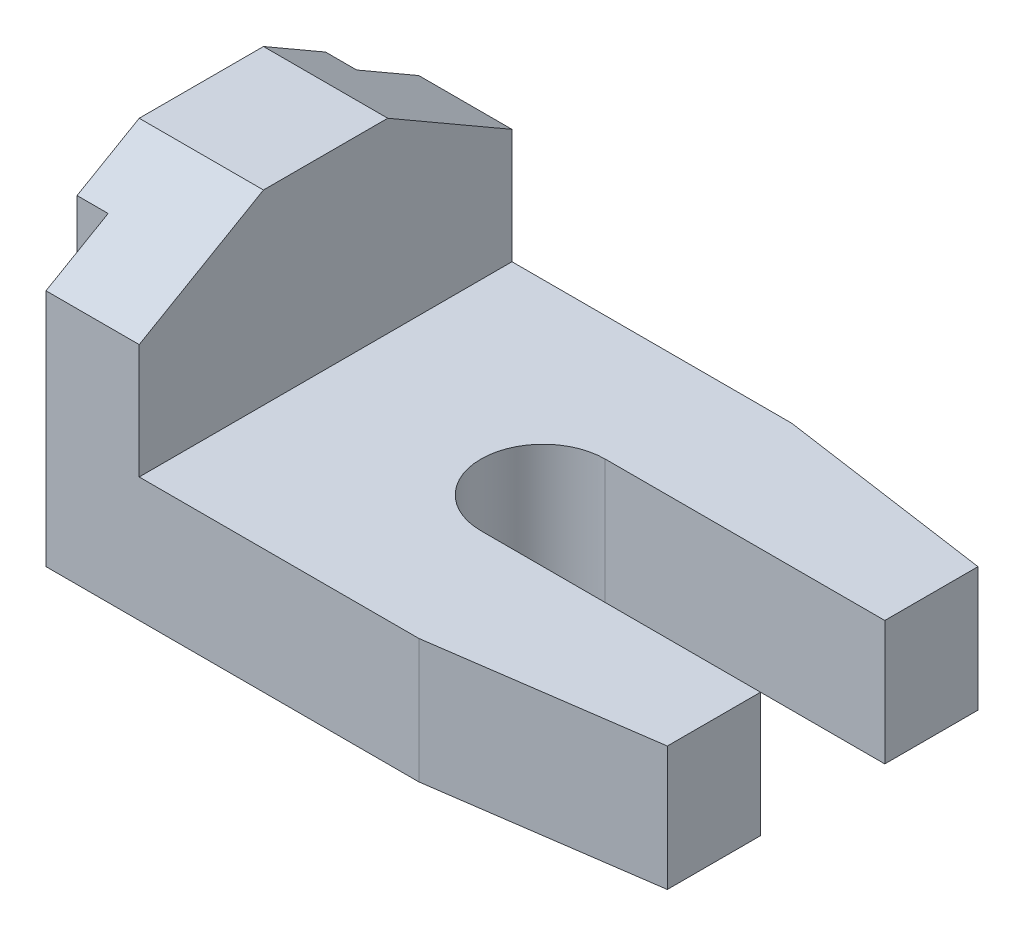
ISO-10303-21;
HEADER;
FILE_DESCRIPTION(('STEP AP214'),'2;1');
FILE_NAME('part.step','',(''),(''),'','','');
FILE_SCHEMA(('AUTOMOTIVE_DESIGN { 1 0 10303 214 1 1 1 1 }'));
ENDSEC;
DATA;
#1=APPLICATION_CONTEXT('core data for automotive mechanical design processes');
#2=APPLICATION_PROTOCOL_DEFINITION('international standard','automotive_design',2000,#1);
#3=PRODUCT_CONTEXT('',#1,'mechanical');
#4=PRODUCT('Part','Part','',(#3));
#5=PRODUCT_RELATED_PRODUCT_CATEGORY('part','',(#4));
#6=PRODUCT_DEFINITION_FORMATION('','',#4);
#7=PRODUCT_DEFINITION_CONTEXT('part definition',#1,'design');
#8=PRODUCT_DEFINITION('design','',#6,#7);
#9=PRODUCT_DEFINITION_SHAPE('','',#8);
#10=(LENGTH_UNIT() NAMED_UNIT(*) SI_UNIT(.MILLI.,.METRE.));
#11=(NAMED_UNIT(*) PLANE_ANGLE_UNIT() SI_UNIT($,.RADIAN.));
#12=(NAMED_UNIT(*) SI_UNIT($,.STERADIAN.) SOLID_ANGLE_UNIT());
#13=UNCERTAINTY_MEASURE_WITH_UNIT(LENGTH_MEASURE(1.E-05),#10,'distance_accuracy_value','');
#14=(GEOMETRIC_REPRESENTATION_CONTEXT(3) GLOBAL_UNCERTAINTY_ASSIGNED_CONTEXT((#13)) GLOBAL_UNIT_ASSIGNED_CONTEXT((#10,
#11,#12)) REPRESENTATION_CONTEXT('',''));
#15=CARTESIAN_POINT('',(0.,0.,0.));
#16=DIRECTION('',(0.,0.,1.));
#17=DIRECTION('',(1.,0.,0.));
#18=AXIS2_PLACEMENT_3D('',#15,#16,#17);
#19=CARTESIAN_POINT('',(57.15,25.4,38.1));
#20=DIRECTION('',(0.,0.,-1.));
#21=DIRECTION('',(-1.,0.,0.));
#22=AXIS2_PLACEMENT_3D('',#19,#20,#21);
#23=PLANE('',#22);
#24=DIRECTION('',(0.,-1.,0.));
#25=VECTOR('',#24,1.);
#26=CARTESIAN_POINT('',(0.,63.5,38.1));
#27=LINE('',#26,#25);
#28=CARTESIAN_POINT('',(0.,48.8353031625835,38.1));
#29=VERTEX_POINT('',#28);
#30=CARTESIAN_POINT('',(0.,25.4,38.1));
#31=VERTEX_POINT('',#30);
#32=EDGE_CURVE('E174',#29,#31,#27,.T.);
#33=ORIENTED_EDGE('',*,*,#32,.F.);
#34=DIRECTION('',(1.,0.,0.));
#35=VECTOR('',#34,1.);
#36=CARTESIAN_POINT('',(-63.5,48.8353031625835,38.1));
#37=LINE('',#36,#35);
#38=CARTESIAN_POINT('',(-19.05,48.8353031625835,38.1));
#39=VERTEX_POINT('',#38);
#40=EDGE_CURVE('E161',#39,#29,#37,.T.);
#41=ORIENTED_EDGE('',*,*,#40,.F.);
#42=DIRECTION('',(0.,-1.,0.));
#43=VECTOR('',#42,1.);
#44=CARTESIAN_POINT('',(-19.05,63.5,38.1));
#45=LINE('',#44,#43);
#46=CARTESIAN_POINT('',(-19.05,0.,38.1));
#47=VERTEX_POINT('',#46);
#48=EDGE_CURVE('E186',#39,#47,#45,.T.);
#49=ORIENTED_EDGE('',*,*,#48,.T.);
#50=DIRECTION('',(1.,0.,0.));
#51=VECTOR('',#50,1.);
#52=CARTESIAN_POINT('',(57.15,0.,38.1));
#53=LINE('',#52,#51);
#54=CARTESIAN_POINT('',(57.15,0.,38.1));
#55=VERTEX_POINT('',#54);
#56=EDGE_CURVE('E229',#47,#55,#53,.T.);
#57=ORIENTED_EDGE('',*,*,#56,.T.);
#58=DIRECTION('',(0.,-1.,0.));
#59=VECTOR('',#58,1.);
#60=CARTESIAN_POINT('',(57.15,25.4,38.1));
#61=LINE('',#60,#59);
#62=CARTESIAN_POINT('',(57.15,25.4,38.1));
#63=VERTEX_POINT('',#62);
#64=EDGE_CURVE('E284',#63,#55,#61,.T.);
#65=ORIENTED_EDGE('',*,*,#64,.F.);
#66=DIRECTION('',(1.,0.,0.));
#67=VECTOR('',#66,1.);
#68=CARTESIAN_POINT('',(57.15,25.4,38.1));
#69=LINE('',#68,#67);
#70=EDGE_CURVE('E183',#31,#63,#69,.T.);
#71=ORIENTED_EDGE('',*,*,#70,.F.);
#72=EDGE_LOOP('',(#33,#41,#49,#57,#65,#71));
#73=FACE_BOUND('',#72,.T.);
#74=ADVANCED_FACE('F39',(#73),#23,.F.);
#75=CARTESIAN_POINT('',(101.6,25.4,31.75));
#76=DIRECTION('',(-0.14142135623731,0.,-0.989949493661166));
#77=DIRECTION('',(-0.989949493661167,0.,0.14142135623731));
#78=AXIS2_PLACEMENT_3D('',#75,#76,#77);
#79=PLANE('',#78);
#80=DIRECTION('',(0.989949493661166,0.,-0.14142135623731));
#81=VECTOR('',#80,1.);
#82=CARTESIAN_POINT('',(101.6,0.,31.75));
#83=LINE('',#82,#81);
#84=CARTESIAN_POINT('',(101.6,0.,31.75));
#85=VERTEX_POINT('',#84);
#86=EDGE_CURVE('E232',#55,#85,#83,.T.);
#87=ORIENTED_EDGE('',*,*,#86,.T.);
#88=DIRECTION('',(0.,-1.,0.));
#89=VECTOR('',#88,1.);
#90=CARTESIAN_POINT('',(101.6,25.4,31.75));
#91=LINE('',#90,#89);
#92=CARTESIAN_POINT('',(101.6,25.4,31.75));
#93=VERTEX_POINT('',#92);
#94=EDGE_CURVE('E280',#93,#85,#91,.T.);
#95=ORIENTED_EDGE('',*,*,#94,.F.);
#96=DIRECTION('',(0.989949493661166,0.,-0.14142135623731));
#97=VECTOR('',#96,1.);
#98=CARTESIAN_POINT('',(101.6,25.4,31.75));
#99=LINE('',#98,#97);
#100=EDGE_CURVE('E203',#63,#93,#99,.T.);
#101=ORIENTED_EDGE('',*,*,#100,.F.);
#102=ORIENTED_EDGE('',*,*,#64,.T.);
#103=EDGE_LOOP('',(#87,#95,#101,#102));
#104=FACE_BOUND('',#103,.T.);
#105=ADVANCED_FACE('F351',(#104),#79,.F.);
#106=CARTESIAN_POINT('',(101.6,25.4,12.7));
#107=DIRECTION('',(-1.,0.,0.));
#108=DIRECTION('',(0.,0.,1.));
#109=AXIS2_PLACEMENT_3D('',#106,#107,#108);
#110=PLANE('',#109);
#111=DIRECTION('',(0.,0.,-1.));
#112=VECTOR('',#111,1.);
#113=CARTESIAN_POINT('',(101.6,0.,12.7));
#114=LINE('',#113,#112);
#115=CARTESIAN_POINT('',(101.6,0.,12.7));
#116=VERTEX_POINT('',#115);
#117=EDGE_CURVE('E236',#85,#116,#114,.T.);
#118=ORIENTED_EDGE('',*,*,#117,.T.);
#119=DIRECTION('',(0.,-1.,0.));
#120=VECTOR('',#119,1.);
#121=CARTESIAN_POINT('',(101.6,25.4,12.7));
#122=LINE('',#121,#120);
#123=CARTESIAN_POINT('',(101.6,25.4,12.7));
#124=VERTEX_POINT('',#123);
#125=EDGE_CURVE('E276',#124,#116,#122,.T.);
#126=ORIENTED_EDGE('',*,*,#125,.F.);
#127=DIRECTION('',(0.,0.,-1.));
#128=VECTOR('',#127,1.);
#129=CARTESIAN_POINT('',(101.6,25.4,12.7));
#130=LINE('',#129,#128);
#131=EDGE_CURVE('E206',#93,#124,#130,.T.);
#132=ORIENTED_EDGE('',*,*,#131,.F.);
#133=ORIENTED_EDGE('',*,*,#94,.T.);
#134=EDGE_LOOP('',(#118,#126,#132,#133));
#135=FACE_BOUND('',#134,.T.);
#136=ADVANCED_FACE('F416',(#135),#110,.F.);
#137=CARTESIAN_POINT('',(44.45,25.4,12.7));
#138=DIRECTION('',(0.,0.,1.));
#139=DIRECTION('',(1.,0.,0.));
#140=AXIS2_PLACEMENT_3D('',#137,#138,#139);
#141=PLANE('',#140);
#142=DIRECTION('',(-1.,0.,0.));
#143=VECTOR('',#142,1.);
#144=CARTESIAN_POINT('',(44.45,0.,12.7));
#145=LINE('',#144,#143);
#146=CARTESIAN_POINT('',(44.45,0.,12.7));
#147=VERTEX_POINT('',#146);
#148=EDGE_CURVE('E239',#116,#147,#145,.T.);
#149=ORIENTED_EDGE('',*,*,#148,.T.);
#150=DIRECTION('',(0.,-1.,0.));
#151=VECTOR('',#150,1.);
#152=CARTESIAN_POINT('',(44.45,25.4,12.7));
#153=LINE('',#152,#151);
#154=CARTESIAN_POINT('',(44.45,25.4,12.7));
#155=VERTEX_POINT('',#154);
#156=EDGE_CURVE('E272',#155,#147,#153,.T.);
#157=ORIENTED_EDGE('',*,*,#156,.F.);
#158=DIRECTION('',(-1.,0.,0.));
#159=VECTOR('',#158,1.);
#160=CARTESIAN_POINT('',(44.45,25.4,12.7));
#161=LINE('',#160,#159);
#162=EDGE_CURVE('E209',#124,#155,#161,.T.);
#163=ORIENTED_EDGE('',*,*,#162,.F.);
#164=ORIENTED_EDGE('',*,*,#125,.T.);
#165=EDGE_LOOP('',(#149,#157,#163,#164));
#166=FACE_BOUND('',#165,.T.);
#167=ADVANCED_FACE('F414',(#166),#141,.F.);
#168=CARTESIAN_POINT('',(44.45,25.4,0.));
#169=DIRECTION('',(0.,-1.,0.));
#170=DIRECTION('',(0.,0.,-1.));
#171=AXIS2_PLACEMENT_3D('',#168,#169,#170);
#172=CYLINDRICAL_SURFACE('',#171,12.7);
#173=CARTESIAN_POINT('',(44.45,0.,0.));
#174=DIRECTION('',(0.,-1.,0.));
#175=DIRECTION('',(0.,0.,1.));
#176=AXIS2_PLACEMENT_3D('',#173,#174,#175);
#177=CIRCLE('',#176,12.7);
#178=CARTESIAN_POINT('',(44.45,0.,-12.7));
#179=VERTEX_POINT('',#178);
#180=EDGE_CURVE('E242',#147,#179,#177,.T.);
#181=ORIENTED_EDGE('',*,*,#180,.T.);
#182=DIRECTION('',(0.,-1.,0.));
#183=VECTOR('',#182,1.);
#184=CARTESIAN_POINT('',(44.45,25.4,-12.7));
#185=LINE('',#184,#183);
#186=CARTESIAN_POINT('',(44.45,25.4,-12.7));
#187=VERTEX_POINT('',#186);
#188=EDGE_CURVE('E268',#187,#179,#185,.T.);
#189=ORIENTED_EDGE('',*,*,#188,.F.);
#190=CARTESIAN_POINT('',(44.45,25.4,0.));
#191=DIRECTION('',(0.,-1.,0.));
#192=DIRECTION('',(0.,0.,1.));
#193=AXIS2_PLACEMENT_3D('',#190,#191,#192);
#194=CIRCLE('',#193,12.7);
#195=EDGE_CURVE('E212',#155,#187,#194,.T.);
#196=ORIENTED_EDGE('',*,*,#195,.F.);
#197=ORIENTED_EDGE('',*,*,#156,.T.);
#198=EDGE_LOOP('',(#181,#189,#196,#197));
#199=FACE_BOUND('',#198,.T.);
#200=ADVANCED_FACE('F409',(#199),#172,.F.);
#201=CARTESIAN_POINT('',(101.6,25.4,-12.7));
#202=DIRECTION('',(0.,0.,-1.));
#203=DIRECTION('',(-1.,0.,0.));
#204=AXIS2_PLACEMENT_3D('',#201,#202,#203);
#205=PLANE('',#204);
#206=DIRECTION('',(1.,0.,0.));
#207=VECTOR('',#206,1.);
#208=CARTESIAN_POINT('',(101.6,0.,-12.7));
#209=LINE('',#208,#207);
#210=CARTESIAN_POINT('',(101.6,0.,-12.7));
#211=VERTEX_POINT('',#210);
#212=EDGE_CURVE('E245',#179,#211,#209,.T.);
#213=ORIENTED_EDGE('',*,*,#212,.T.);
#214=DIRECTION('',(0.,-1.,0.));
#215=VECTOR('',#214,1.);
#216=CARTESIAN_POINT('',(101.6,25.4,-12.7));
#217=LINE('',#216,#215);
#218=CARTESIAN_POINT('',(101.6,25.4,-12.7));
#219=VERTEX_POINT('',#218);
#220=EDGE_CURVE('E264',#219,#211,#217,.T.);
#221=ORIENTED_EDGE('',*,*,#220,.F.);
#222=DIRECTION('',(1.,0.,0.));
#223=VECTOR('',#222,1.);
#224=CARTESIAN_POINT('',(101.6,25.4,-12.7));
#225=LINE('',#224,#223);
#226=EDGE_CURVE('E215',#187,#219,#225,.T.);
#227=ORIENTED_EDGE('',*,*,#226,.F.);
#228=ORIENTED_EDGE('',*,*,#188,.T.);
#229=EDGE_LOOP('',(#213,#221,#227,#228));
#230=FACE_BOUND('',#229,.T.);
#231=ADVANCED_FACE('F404',(#230),#205,.F.);
#232=CARTESIAN_POINT('',(101.6,25.4,-31.75));
#233=DIRECTION('',(-1.,0.,0.));
#234=DIRECTION('',(0.,0.,1.));
#235=AXIS2_PLACEMENT_3D('',#232,#233,#234);
#236=PLANE('',#235);
#237=DIRECTION('',(0.,0.,-1.));
#238=VECTOR('',#237,1.);
#239=CARTESIAN_POINT('',(101.6,0.,-31.75));
#240=LINE('',#239,#238);
#241=CARTESIAN_POINT('',(101.6,0.,-31.75));
#242=VERTEX_POINT('',#241);
#243=EDGE_CURVE('E248',#211,#242,#240,.T.);
#244=ORIENTED_EDGE('',*,*,#243,.T.);
#245=DIRECTION('',(0.,-1.,0.));
#246=VECTOR('',#245,1.);
#247=CARTESIAN_POINT('',(101.6,25.4,-31.75));
#248=LINE('',#247,#246);
#249=CARTESIAN_POINT('',(101.6,25.4,-31.75));
#250=VERTEX_POINT('',#249);
#251=EDGE_CURVE('E260',#250,#242,#248,.T.);
#252=ORIENTED_EDGE('',*,*,#251,.F.);
#253=DIRECTION('',(0.,0.,-1.));
#254=VECTOR('',#253,1.);
#255=CARTESIAN_POINT('',(101.6,25.4,-31.75));
#256=LINE('',#255,#254);
#257=EDGE_CURVE('E218',#219,#250,#256,.T.);
#258=ORIENTED_EDGE('',*,*,#257,.F.);
#259=ORIENTED_EDGE('',*,*,#220,.T.);
#260=EDGE_LOOP('',(#244,#252,#258,#259));
#261=FACE_BOUND('',#260,.T.);
#262=ADVANCED_FACE('F400',(#261),#236,.F.);
#263=CARTESIAN_POINT('',(57.15,25.4,-38.1));
#264=DIRECTION('',(-0.14142135623731,0.,0.989949493661167));
#265=DIRECTION('',(0.989949493661167,0.,0.14142135623731));
#266=AXIS2_PLACEMENT_3D('',#263,#264,#265);
#267=PLANE('',#266);
#268=DIRECTION('',(-0.989949493661167,0.,-0.14142135623731));
#269=VECTOR('',#268,1.);
#270=CARTESIAN_POINT('',(57.15,0.,-38.1));
#271=LINE('',#270,#269);
#272=CARTESIAN_POINT('',(57.15,0.,-38.1));
#273=VERTEX_POINT('',#272);
#274=EDGE_CURVE('E251',#242,#273,#271,.T.);
#275=ORIENTED_EDGE('',*,*,#274,.T.);
#276=DIRECTION('',(0.,-1.,0.));
#277=VECTOR('',#276,1.);
#278=CARTESIAN_POINT('',(57.15,25.4,-38.1));
#279=LINE('',#278,#277);
#280=CARTESIAN_POINT('',(57.15,25.4,-38.1));
#281=VERTEX_POINT('',#280);
#282=EDGE_CURVE('E228',#281,#273,#279,.T.);
#283=ORIENTED_EDGE('',*,*,#282,.F.);
#284=DIRECTION('',(-0.989949493661167,0.,-0.14142135623731));
#285=VECTOR('',#284,1.);
#286=CARTESIAN_POINT('',(57.15,25.4,-38.1));
#287=LINE('',#286,#285);
#288=EDGE_CURVE('E221',#250,#281,#287,.T.);
#289=ORIENTED_EDGE('',*,*,#288,.F.);
#290=ORIENTED_EDGE('',*,*,#251,.T.);
#291=EDGE_LOOP('',(#275,#283,#289,#290));
#292=FACE_BOUND('',#291,.T.);
#293=ADVANCED_FACE('F395',(#292),#267,.F.);
#294=CARTESIAN_POINT('',(0.,25.4,-38.1));
#295=DIRECTION('',(0.,0.,1.));
#296=DIRECTION('',(1.,0.,0.));
#297=AXIS2_PLACEMENT_3D('',#294,#295,#296);
#298=PLANE('',#297);
#299=DIRECTION('',(0.,-1.,0.));
#300=VECTOR('',#299,1.);
#301=CARTESIAN_POINT('',(-19.05,63.5,-38.1));
#302=LINE('',#301,#300);
#303=CARTESIAN_POINT('',(-19.05,48.8353031625835,-38.1));
#304=VERTEX_POINT('',#303);
#305=CARTESIAN_POINT('',(-19.05,0.,-38.1));
#306=VERTEX_POINT('',#305);
#307=EDGE_CURVE('E233',#304,#306,#302,.T.);
#308=ORIENTED_EDGE('',*,*,#307,.F.);
#309=DIRECTION('',(1.,0.,0.));
#310=VECTOR('',#309,1.);
#311=CARTESIAN_POINT('',(-63.5,48.8353031625835,-38.1));
#312=LINE('',#311,#310);
#313=CARTESIAN_POINT('',(0.,48.8353031625835,-38.1));
#314=VERTEX_POINT('',#313);
#315=EDGE_CURVE('E180',#304,#314,#312,.T.);
#316=ORIENTED_EDGE('',*,*,#315,.T.);
#317=DIRECTION('',(0.,-1.,0.));
#318=VECTOR('',#317,1.);
#319=CARTESIAN_POINT('',(0.,63.5,-38.1));
#320=LINE('',#319,#318);
#321=CARTESIAN_POINT('',(0.,25.4,-38.1));
#322=VERTEX_POINT('',#321);
#323=EDGE_CURVE('E187',#314,#322,#320,.T.);
#324=ORIENTED_EDGE('',*,*,#323,.T.);
#325=DIRECTION('',(-1.,0.,0.));
#326=VECTOR('',#325,1.);
#327=CARTESIAN_POINT('',(0.,25.4,-38.1));
#328=LINE('',#327,#326);
#329=EDGE_CURVE('E224',#281,#322,#328,.T.);
#330=ORIENTED_EDGE('',*,*,#329,.F.);
#331=ORIENTED_EDGE('',*,*,#282,.T.);
#332=DIRECTION('',(-1.,0.,0.));
#333=VECTOR('',#332,1.);
#334=CARTESIAN_POINT('',(0.,0.,-38.1));
#335=LINE('',#334,#333);
#336=EDGE_CURVE('E200',#273,#306,#335,.T.);
#337=ORIENTED_EDGE('',*,*,#336,.T.);
#338=EDGE_LOOP('',(#308,#316,#324,#330,#331,#337));
#339=FACE_BOUND('',#338,.T.);
#340=ADVANCED_FACE('F363',(#339),#298,.F.);
#341=CARTESIAN_POINT('',(44.45,25.4,0.));
#342=DIRECTION('',(0.,1.,0.));
#343=DIRECTION('',(0.,0.,1.));
#344=AXIS2_PLACEMENT_3D('',#341,#342,#343);
#345=PLANE('',#344);
#346=DIRECTION('',(0.,0.,1.));
#347=VECTOR('',#346,1.);
#348=CARTESIAN_POINT('',(0.,25.4,38.1));
#349=LINE('',#348,#347);
#350=EDGE_CURVE('E197',#322,#31,#349,.T.);
#351=ORIENTED_EDGE('',*,*,#350,.T.);
#352=ORIENTED_EDGE('',*,*,#70,.T.);
#353=ORIENTED_EDGE('',*,*,#100,.T.);
#354=ORIENTED_EDGE('',*,*,#131,.T.);
#355=ORIENTED_EDGE('',*,*,#162,.T.);
#356=ORIENTED_EDGE('',*,*,#195,.T.);
#357=ORIENTED_EDGE('',*,*,#226,.T.);
#358=ORIENTED_EDGE('',*,*,#257,.T.);
#359=ORIENTED_EDGE('',*,*,#288,.T.);
#360=ORIENTED_EDGE('',*,*,#329,.T.);
#361=EDGE_LOOP('',(#351,#352,#353,#354,#355,#356,#357,#358,#359,#360));
#362=FACE_BOUND('',#361,.T.);
#363=ADVANCED_FACE('F355',(#362),#345,.T.);
#364=CARTESIAN_POINT('',(44.45,0.,0.));
#365=DIRECTION('',(0.,1.,0.));
#366=DIRECTION('',(0.,0.,1.));
#367=AXIS2_PLACEMENT_3D('',#364,#365,#366);
#368=PLANE('',#367);
#369=ORIENTED_EDGE('',*,*,#56,.F.);
#370=DIRECTION('',(0.,0.,-1.));
#371=VECTOR('',#370,1.);
#372=CARTESIAN_POINT('',(-19.05,0.,38.1));
#373=LINE('',#372,#371);
#374=CARTESIAN_POINT('',(-19.05,0.,25.4));
#375=VERTEX_POINT('',#374);
#376=EDGE_CURVE('E305',#47,#375,#373,.T.);
#377=ORIENTED_EDGE('',*,*,#376,.T.);
#378=DIRECTION('',(-1.,0.,0.));
#379=VECTOR('',#378,1.);
#380=CARTESIAN_POINT('',(-19.05,0.,25.4));
#381=LINE('',#380,#379);
#382=CARTESIAN_POINT('',(-25.4,0.,25.4));
#383=VERTEX_POINT('',#382);
#384=EDGE_CURVE('E309',#375,#383,#381,.T.);
#385=ORIENTED_EDGE('',*,*,#384,.T.);
#386=DIRECTION('',(0.,0.,-1.));
#387=VECTOR('',#386,1.);
#388=CARTESIAN_POINT('',(-25.4,0.,25.4));
#389=LINE('',#388,#387);
#390=CARTESIAN_POINT('',(-25.4,0.,-25.4));
#391=VERTEX_POINT('',#390);
#392=EDGE_CURVE('E313',#383,#391,#389,.T.);
#393=ORIENTED_EDGE('',*,*,#392,.T.);
#394=DIRECTION('',(1.,0.,0.));
#395=VECTOR('',#394,1.);
#396=CARTESIAN_POINT('',(-25.4,0.,-25.4));
#397=LINE('',#396,#395);
#398=CARTESIAN_POINT('',(-19.05,0.,-25.4));
#399=VERTEX_POINT('',#398);
#400=EDGE_CURVE('E317',#391,#399,#397,.T.);
#401=ORIENTED_EDGE('',*,*,#400,.T.);
#402=DIRECTION('',(0.,0.,-1.));
#403=VECTOR('',#402,1.);
#404=CARTESIAN_POINT('',(-19.05,0.,-25.4));
#405=LINE('',#404,#403);
#406=EDGE_CURVE('E301',#399,#306,#405,.T.);
#407=ORIENTED_EDGE('',*,*,#406,.T.);
#408=ORIENTED_EDGE('',*,*,#336,.F.);
#409=ORIENTED_EDGE('',*,*,#274,.F.);
#410=ORIENTED_EDGE('',*,*,#243,.F.);
#411=ORIENTED_EDGE('',*,*,#212,.F.);
#412=ORIENTED_EDGE('',*,*,#180,.F.);
#413=ORIENTED_EDGE('',*,*,#148,.F.);
#414=ORIENTED_EDGE('',*,*,#117,.F.);
#415=ORIENTED_EDGE('',*,*,#86,.F.);
#416=EDGE_LOOP('',(#369,#377,#385,#393,#401,#407,#408,#409,#410,#411,#412,#413,#414,#415));
#417=FACE_BOUND('',#416,.T.);
#418=ADVANCED_FACE('F346',(#417),#368,.F.);
#419=CARTESIAN_POINT('',(0.,63.5,-38.1));
#420=DIRECTION('',(1.,0.,0.));
#421=DIRECTION('',(0.,0.,-1.));
#422=AXIS2_PLACEMENT_3D('',#419,#420,#421);
#423=PLANE('',#422);
#424=DIRECTION('',(0.,0.500000000000001,-0.866025403784438));
#425=VECTOR('',#424,1.);
#426=CARTESIAN_POINT('',(0.,48.8353031625835,38.1));
#427=LINE('',#426,#425);
#428=CARTESIAN_POINT('',(0.,63.5,12.7));
#429=VERTEX_POINT('',#428);
#430=EDGE_CURVE('E54',#29,#429,#427,.T.);
#431=ORIENTED_EDGE('',*,*,#430,.F.);
#432=ORIENTED_EDGE('',*,*,#32,.T.);
#433=ORIENTED_EDGE('',*,*,#350,.F.);
#434=ORIENTED_EDGE('',*,*,#323,.F.);
#435=DIRECTION('',(0.,-0.500000000000001,-0.866025403784438));
#436=VECTOR('',#435,1.);
#437=CARTESIAN_POINT('',(0.,63.5,-12.7));
#438=LINE('',#437,#436);
#439=CARTESIAN_POINT('',(0.,63.5,-12.7));
#440=VERTEX_POINT('',#439);
#441=EDGE_CURVE('E359',#440,#314,#438,.T.);
#442=ORIENTED_EDGE('',*,*,#441,.F.);
#443=DIRECTION('',(0.,0.,1.));
#444=VECTOR('',#443,1.);
#445=CARTESIAN_POINT('',(0.,63.5,-38.1));
#446=LINE('',#445,#444);
#447=EDGE_CURVE('E178',#440,#429,#446,.T.);
#448=ORIENTED_EDGE('',*,*,#447,.T.);
#449=EDGE_LOOP('',(#431,#432,#433,#434,#442,#448));
#450=FACE_BOUND('',#449,.T.);
#451=ADVANCED_FACE('F172',(#450),#423,.T.);
#452=CARTESIAN_POINT('',(-19.05,63.5,-25.4));
#453=DIRECTION('',(-1.,0.,0.));
#454=DIRECTION('',(0.,0.,1.));
#455=AXIS2_PLACEMENT_3D('',#452,#453,#454);
#456=PLANE('',#455);
#457=DIRECTION('',(0.,0.500000000000001,0.866025403784438));
#458=VECTOR('',#457,1.);
#459=CARTESIAN_POINT('',(-19.05,58.0007386859688,-22.225));
#460=LINE('',#459,#458);
#461=CARTESIAN_POINT('',(-19.05,56.1676515812917,-25.4));
#462=VERTEX_POINT('',#461);
#463=EDGE_CURVE('E375',#304,#462,#460,.T.);
#464=ORIENTED_EDGE('',*,*,#463,.F.);
#465=ORIENTED_EDGE('',*,*,#307,.T.);
#466=ORIENTED_EDGE('',*,*,#406,.F.);
#467=DIRECTION('',(0.,-1.,0.));
#468=VECTOR('',#467,1.);
#469=CARTESIAN_POINT('',(-19.05,63.5,-25.4));
#470=LINE('',#469,#468);
#471=EDGE_CURVE('E326',#462,#399,#470,.T.);
#472=ORIENTED_EDGE('',*,*,#471,.F.);
#473=EDGE_LOOP('',(#464,#465,#466,#472));
#474=FACE_BOUND('',#473,.T.);
#475=ADVANCED_FACE('F389',(#474),#456,.T.);
#476=CARTESIAN_POINT('',(-25.4,63.5,-25.4));
#477=DIRECTION('',(0.,0.,-1.));
#478=DIRECTION('',(-1.,0.,0.));
#479=AXIS2_PLACEMENT_3D('',#476,#477,#478);
#480=PLANE('',#479);
#481=DIRECTION('',(-1.,0.,0.));
#482=VECTOR('',#481,1.);
#483=CARTESIAN_POINT('',(-25.4,56.1676515812917,-25.4));
#484=LINE('',#483,#482);
#485=CARTESIAN_POINT('',(-25.4,56.1676515812917,-25.4));
#486=VERTEX_POINT('',#485);
#487=EDGE_CURVE('E372',#462,#486,#484,.T.);
#488=ORIENTED_EDGE('',*,*,#487,.F.);
#489=ORIENTED_EDGE('',*,*,#471,.T.);
#490=ORIENTED_EDGE('',*,*,#400,.F.);
#491=DIRECTION('',(0.,-1.,0.));
#492=VECTOR('',#491,1.);
#493=CARTESIAN_POINT('',(-25.4,63.5,-25.4));
#494=LINE('',#493,#492);
#495=EDGE_CURVE('E329',#486,#391,#494,.T.);
#496=ORIENTED_EDGE('',*,*,#495,.F.);
#497=EDGE_LOOP('',(#488,#489,#490,#496));
#498=FACE_BOUND('',#497,.T.);
#499=ADVANCED_FACE('F509',(#498),#480,.T.);
#500=CARTESIAN_POINT('',(-25.4,63.5,25.4));
#501=DIRECTION('',(-1.,0.,0.));
#502=DIRECTION('',(0.,0.,1.));
#503=AXIS2_PLACEMENT_3D('',#500,#501,#502);
#504=PLANE('',#503);
#505=DIRECTION('',(0.,-0.500000000000001,0.866025403784438));
#506=VECTOR('',#505,1.);
#507=CARTESIAN_POINT('',(-25.4,58.0007386859688,22.225));
#508=LINE('',#507,#506);
#509=CARTESIAN_POINT('',(-25.4,63.5,12.7));
#510=VERTEX_POINT('',#509);
#511=CARTESIAN_POINT('',(-25.4,56.1676515812917,25.4));
#512=VERTEX_POINT('',#511);
#513=EDGE_CURVE('E297',#510,#512,#508,.T.);
#514=ORIENTED_EDGE('',*,*,#513,.F.);
#515=DIRECTION('',(0.,0.,-1.));
#516=VECTOR('',#515,1.);
#517=CARTESIAN_POINT('',(-25.4,63.5,25.4));
#518=LINE('',#517,#516);
#519=CARTESIAN_POINT('',(-25.4,63.5,-12.7));
#520=VERTEX_POINT('',#519);
#521=EDGE_CURVE('E193',#510,#520,#518,.T.);
#522=ORIENTED_EDGE('',*,*,#521,.T.);
#523=DIRECTION('',(0.,0.500000000000001,0.866025403784438));
#524=VECTOR('',#523,1.);
#525=CARTESIAN_POINT('',(-25.4,79.9977839420936,15.875));
#526=LINE('',#525,#524);
#527=EDGE_CURVE('E61',#486,#520,#526,.T.);
#528=ORIENTED_EDGE('',*,*,#527,.F.);
#529=ORIENTED_EDGE('',*,*,#495,.T.);
#530=ORIENTED_EDGE('',*,*,#392,.F.);
#531=DIRECTION('',(0.,-1.,0.));
#532=VECTOR('',#531,1.);
#533=CARTESIAN_POINT('',(-25.4,63.5,25.4));
#534=LINE('',#533,#532);
#535=EDGE_CURVE('E332',#512,#383,#534,.T.);
#536=ORIENTED_EDGE('',*,*,#535,.F.);
#537=EDGE_LOOP('',(#514,#522,#528,#529,#530,#536));
#538=FACE_BOUND('',#537,.T.);
#539=ADVANCED_FACE('F294',(#538),#504,.T.);
#540=CARTESIAN_POINT('',(-19.05,63.5,25.4));
#541=DIRECTION('',(0.,0.,1.));
#542=DIRECTION('',(1.,0.,0.));
#543=AXIS2_PLACEMENT_3D('',#540,#541,#542);
#544=PLANE('',#543);
#545=DIRECTION('',(1.,0.,0.));
#546=VECTOR('',#545,1.);
#547=CARTESIAN_POINT('',(-19.05,56.1676515812917,25.4));
#548=LINE('',#547,#546);
#549=CARTESIAN_POINT('',(-19.05,56.1676515812917,25.4));
#550=VERTEX_POINT('',#549);
#551=EDGE_CURVE('E380',#512,#550,#548,.T.);
#552=ORIENTED_EDGE('',*,*,#551,.F.);
#553=ORIENTED_EDGE('',*,*,#535,.T.);
#554=ORIENTED_EDGE('',*,*,#384,.F.);
#555=DIRECTION('',(0.,-1.,0.));
#556=VECTOR('',#555,1.);
#557=CARTESIAN_POINT('',(-19.05,63.5,25.4));
#558=LINE('',#557,#556);
#559=EDGE_CURVE('E191',#550,#375,#558,.T.);
#560=ORIENTED_EDGE('',*,*,#559,.F.);
#561=EDGE_LOOP('',(#552,#553,#554,#560));
#562=FACE_BOUND('',#561,.T.);
#563=ADVANCED_FACE('F342',(#562),#544,.T.);
#564=CARTESIAN_POINT('',(-19.05,63.5,38.1));
#565=DIRECTION('',(-1.,0.,0.));
#566=DIRECTION('',(0.,0.,1.));
#567=AXIS2_PLACEMENT_3D('',#564,#565,#566);
#568=PLANE('',#567);
#569=DIRECTION('',(0.,-0.500000000000001,0.866025403784438));
#570=VECTOR('',#569,1.);
#571=CARTESIAN_POINT('',(-19.05,52.5014773719376,31.75));
#572=LINE('',#571,#570);
#573=EDGE_CURVE('E164',#550,#39,#572,.T.);
#574=ORIENTED_EDGE('',*,*,#573,.F.);
#575=ORIENTED_EDGE('',*,*,#559,.T.);
#576=ORIENTED_EDGE('',*,*,#376,.F.);
#577=ORIENTED_EDGE('',*,*,#48,.F.);
#578=EDGE_LOOP('',(#574,#575,#576,#577));
#579=FACE_BOUND('',#578,.T.);
#580=ADVANCED_FACE('F339',(#579),#568,.T.);
#581=CARTESIAN_POINT('',(0.,63.5,0.));
#582=DIRECTION('',(0.,-1.,0.));
#583=DIRECTION('',(0.,0.,-1.));
#584=AXIS2_PLACEMENT_3D('',#581,#582,#583);
#585=PLANE('',#584);
#586=ORIENTED_EDGE('',*,*,#521,.F.);
#587=DIRECTION('',(1.,0.,0.));
#588=VECTOR('',#587,1.);
#589=CARTESIAN_POINT('',(0.,63.5,12.7));
#590=LINE('',#589,#588);
#591=EDGE_CURVE('E11',#510,#429,#590,.T.);
#592=ORIENTED_EDGE('',*,*,#591,.T.);
#593=ORIENTED_EDGE('',*,*,#447,.F.);
#594=DIRECTION('',(-1.,0.,0.));
#595=VECTOR('',#594,1.);
#596=CARTESIAN_POINT('',(0.,63.5,-12.7));
#597=LINE('',#596,#595);
#598=EDGE_CURVE('E47',#440,#520,#597,.T.);
#599=ORIENTED_EDGE('',*,*,#598,.T.);
#600=EDGE_LOOP('',(#586,#592,#593,#599));
#601=FACE_BOUND('',#600,.T.);
#602=ADVANCED_FACE('F291',(#601),#585,.F.);
#603=CARTESIAN_POINT('',(-63.5,63.5,-12.7));
#604=DIRECTION('',(0.,-0.866025403784438,0.500000000000001));
#605=DIRECTION('',(0.,-0.500000000000001,-0.866025403784438));
#606=AXIS2_PLACEMENT_3D('',#603,#604,#605);
#607=PLANE('',#606);
#608=ORIENTED_EDGE('',*,*,#463,.T.);
#609=ORIENTED_EDGE('',*,*,#487,.T.);
#610=ORIENTED_EDGE('',*,*,#527,.T.);
#611=ORIENTED_EDGE('',*,*,#598,.F.);
#612=ORIENTED_EDGE('',*,*,#441,.T.);
#613=ORIENTED_EDGE('',*,*,#315,.F.);
#614=EDGE_LOOP('',(#608,#609,#610,#611,#612,#613));
#615=FACE_BOUND('',#614,.T.);
#616=ADVANCED_FACE('F540',(#615),#607,.F.);
#617=CARTESIAN_POINT('',(-63.5,48.8353031625835,38.1));
#618=DIRECTION('',(0.,-0.866025403784438,-0.500000000000001));
#619=DIRECTION('',(0.,0.500000000000001,-0.866025403784438));
#620=AXIS2_PLACEMENT_3D('',#617,#618,#619);
#621=PLANE('',#620);
#622=ORIENTED_EDGE('',*,*,#513,.T.);
#623=ORIENTED_EDGE('',*,*,#551,.T.);
#624=ORIENTED_EDGE('',*,*,#573,.T.);
#625=ORIENTED_EDGE('',*,*,#40,.T.);
#626=ORIENTED_EDGE('',*,*,#430,.T.);
#627=ORIENTED_EDGE('',*,*,#591,.F.);
#628=EDGE_LOOP('',(#622,#623,#624,#625,#626,#627));
#629=FACE_BOUND('',#628,.T.);
#630=ADVANCED_FACE('F162',(#629),#621,.F.);
#631=CLOSED_SHELL('',(#74,#105,#136,#167,#200,#231,#262,#293,#340,#363,#418,#451,#475,#499,#539,
#563,#580,#602,#616,#630));
#632=MANIFOLD_SOLID_BREP('B2',#631);
#633=ADVANCED_BREP_SHAPE_REPRESENTATION('',(#18,#632),#14);
#634=SHAPE_DEFINITION_REPRESENTATION(#9,#633);
ENDSEC;
END-ISO-10303-21;
